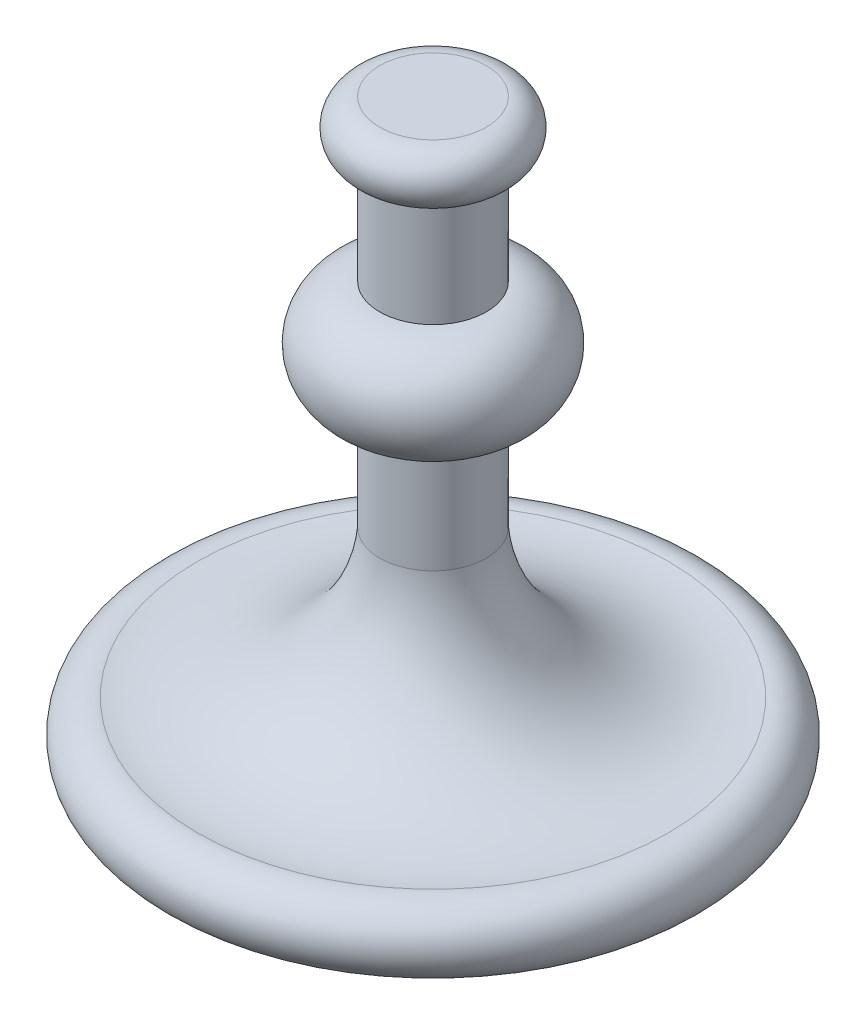
ISO-10303-21;
HEADER;
FILE_DESCRIPTION(('STEP AP214'),'2;1');
FILE_NAME('part.step','',(''),(''),'','','');
FILE_SCHEMA(('AUTOMOTIVE_DESIGN { 1 0 10303 214 1 1 1 1 }'));
ENDSEC;
DATA;
#1=APPLICATION_CONTEXT('core data for automotive mechanical design processes');
#2=APPLICATION_PROTOCOL_DEFINITION('international standard','automotive_design',2000,#1);
#3=PRODUCT_CONTEXT('',#1,'mechanical');
#4=PRODUCT('Part','Part','',(#3));
#5=PRODUCT_RELATED_PRODUCT_CATEGORY('part','',(#4));
#6=PRODUCT_DEFINITION_FORMATION('','',#4);
#7=PRODUCT_DEFINITION_CONTEXT('part definition',#1,'design');
#8=PRODUCT_DEFINITION('design','',#6,#7);
#9=PRODUCT_DEFINITION_SHAPE('','',#8);
#10=(LENGTH_UNIT() NAMED_UNIT(*) SI_UNIT(.MILLI.,.METRE.));
#11=(NAMED_UNIT(*) PLANE_ANGLE_UNIT() SI_UNIT($,.RADIAN.));
#12=(NAMED_UNIT(*) SI_UNIT($,.STERADIAN.) SOLID_ANGLE_UNIT());
#13=UNCERTAINTY_MEASURE_WITH_UNIT(LENGTH_MEASURE(1.E-05),#10,'distance_accuracy_value','');
#14=(GEOMETRIC_REPRESENTATION_CONTEXT(3) GLOBAL_UNCERTAINTY_ASSIGNED_CONTEXT((#13)) GLOBAL_UNIT_ASSIGNED_CONTEXT((#10,
#11,#12)) REPRESENTATION_CONTEXT('',''));
#15=CARTESIAN_POINT('',(0.,0.,0.));
#16=DIRECTION('',(0.,0.,1.));
#17=DIRECTION('',(1.,0.,0.));
#18=AXIS2_PLACEMENT_3D('',#15,#16,#17);
#19=CARTESIAN_POINT('',(0.,0.,0.));
#20=DIRECTION('',(0.,-1.,0.));
#21=DIRECTION('',(0.,0.,-1.));
#22=AXIS2_PLACEMENT_3D('',#19,#20,#21);
#23=PLANE('',#22);
#24=CARTESIAN_POINT('',(0.,0.,0.));
#25=DIRECTION('',(0.,-1.,0.));
#26=DIRECTION('',(0.,0.,-1.));
#27=AXIS2_PLACEMENT_3D('',#24,#25,#26);
#28=CIRCLE('',#27,90.);
#29=CARTESIAN_POINT('',(0.,0.,-90.));
#30=VERTEX_POINT('',#29);
#31=EDGE_CURVE('E10',#30,#30,#28,.T.);
#32=ORIENTED_EDGE('',*,*,#31,.T.);
#33=EDGE_LOOP('',(#32));
#34=FACE_BOUND('',#33,.T.);
#35=ADVANCED_FACE('F31',(#34),#23,.T.);
#36=CARTESIAN_POINT('',(0.,12.5,0.));
#37=DIRECTION('',(0.,-1.,0.));
#38=DIRECTION('',(0.,0.,-1.));
#39=AXIS2_PLACEMENT_3D('',#36,#37,#38);
#40=TOROIDAL_SURFACE('',#39,90.,12.5);
#41=CARTESIAN_POINT('',(0.,24.8768147133355,0.));
#42=DIRECTION('',(0.,-1.,0.));
#43=DIRECTION('',(0.,0.,-1.));
#44=AXIS2_PLACEMENT_3D('',#41,#42,#43);
#45=CIRCLE('',#44,88.2494407888445);
#46=CARTESIAN_POINT('',(0.,24.8768147133355,-88.2494407888445));
#47=VERTEX_POINT('',#46);
#48=EDGE_CURVE('E37',#47,#47,#45,.T.);
#49=ORIENTED_EDGE('',*,*,#48,.T.);
#50=EDGE_LOOP('',(#49));
#51=FACE_BOUND('',#50,.T.);
#52=ORIENTED_EDGE('',*,*,#31,.F.);
#53=EDGE_LOOP('',(#52));
#54=FACE_BOUND('',#53,.T.);
#55=ADVANCED_FACE('F72',(#51,#54),#40,.T.);
#56=CARTESIAN_POINT('',(0.,84.285525337346,0.));
#57=DIRECTION('',(0.,-1.,0.));
#58=DIRECTION('',(0.,0.,-1.));
#59=AXIS2_PLACEMENT_3D('',#56,#57,#58);
#60=TOROIDAL_SURFACE('',#59,79.8467565752979,60.);
#61=CARTESIAN_POINT('',(0.,80.,0.));
#62=DIRECTION('',(0.,-1.,0.));
#63=DIRECTION('',(0.,0.,-1.));
#64=AXIS2_PLACEMENT_3D('',#61,#62,#63);
#65=CIRCLE('',#64,20.);
#66=CARTESIAN_POINT('',(0.,80.,-20.));
#67=VERTEX_POINT('',#66);
#68=EDGE_CURVE('E41',#67,#67,#65,.T.);
#69=ORIENTED_EDGE('',*,*,#68,.T.);
#70=EDGE_LOOP('',(#69));
#71=FACE_BOUND('',#70,.T.);
#72=ORIENTED_EDGE('',*,*,#48,.F.);
#73=EDGE_LOOP('',(#72));
#74=FACE_BOUND('',#73,.T.);
#75=ADVANCED_FACE('F76',(#71,#74),#60,.F.);
#76=CARTESIAN_POINT('',(0.,0.,0.));
#77=DIRECTION('',(0.,-1.,0.));
#78=DIRECTION('',(0.,0.,-1.));
#79=AXIS2_PLACEMENT_3D('',#76,#77,#78);
#80=CYLINDRICAL_SURFACE('',#79,20.);
#81=CARTESIAN_POINT('',(0.,120.,0.));
#82=DIRECTION('',(0.,-1.,0.));
#83=DIRECTION('',(0.,0.,-1.));
#84=AXIS2_PLACEMENT_3D('',#81,#82,#83);
#85=CIRCLE('',#84,20.);
#86=CARTESIAN_POINT('',(0.,120.,-20.));
#87=VERTEX_POINT('',#86);
#88=EDGE_CURVE('E45',#87,#87,#85,.T.);
#89=ORIENTED_EDGE('',*,*,#88,.T.);
#90=EDGE_LOOP('',(#89));
#91=FACE_BOUND('',#90,.T.);
#92=ORIENTED_EDGE('',*,*,#68,.F.);
#93=EDGE_LOOP('',(#92));
#94=FACE_BOUND('',#93,.T.);
#95=ADVANCED_FACE('F80',(#91,#94),#80,.T.);
#96=CARTESIAN_POINT('',(0.,140.,0.));
#97=DIRECTION('',(0.,-1.,0.));
#98=DIRECTION('',(0.,0.,-1.));
#99=AXIS2_PLACEMENT_3D('',#96,#97,#98);
#100=TOROIDAL_SURFACE('',#99,20.,20.);
#101=CARTESIAN_POINT('',(0.,160.,0.));
#102=DIRECTION('',(0.,-1.,0.));
#103=DIRECTION('',(0.,0.,-1.));
#104=AXIS2_PLACEMENT_3D('',#101,#102,#103);
#105=CIRCLE('',#104,20.);
#106=CARTESIAN_POINT('',(0.,160.,-20.));
#107=VERTEX_POINT('',#106);
#108=EDGE_CURVE('E50',#107,#107,#105,.T.);
#109=ORIENTED_EDGE('',*,*,#108,.T.);
#110=EDGE_LOOP('',(#109));
#111=FACE_BOUND('',#110,.T.);
#112=ORIENTED_EDGE('',*,*,#88,.F.);
#113=EDGE_LOOP('',(#112));
#114=FACE_BOUND('',#113,.T.);
#115=ADVANCED_FACE('F87',(#111,#114),#100,.T.);
#116=CARTESIAN_POINT('',(0.,0.,0.));
#117=DIRECTION('',(0.,-1.,0.));
#118=DIRECTION('',(0.,0.,-1.));
#119=AXIS2_PLACEMENT_3D('',#116,#117,#118);
#120=CYLINDRICAL_SURFACE('',#119,20.);
#121=CARTESIAN_POINT('',(0.,200.,0.));
#122=DIRECTION('',(0.,-1.,0.));
#123=DIRECTION('',(0.,0.,-1.));
#124=AXIS2_PLACEMENT_3D('',#121,#122,#123);
#125=CIRCLE('',#124,20.);
#126=CARTESIAN_POINT('',(0.,200.,-20.));
#127=VERTEX_POINT('',#126);
#128=EDGE_CURVE('E53',#127,#127,#125,.T.);
#129=ORIENTED_EDGE('',*,*,#128,.T.);
#130=EDGE_LOOP('',(#129));
#131=FACE_BOUND('',#130,.T.);
#132=ORIENTED_EDGE('',*,*,#108,.F.);
#133=EDGE_LOOP('',(#132));
#134=FACE_BOUND('',#133,.T.);
#135=ADVANCED_FACE('F69',(#131,#134),#120,.T.);
#136=CARTESIAN_POINT('',(0.,210.,0.));
#137=DIRECTION('',(0.,-1.,0.));
#138=DIRECTION('',(0.,0.,-1.));
#139=AXIS2_PLACEMENT_3D('',#136,#137,#138);
#140=TOROIDAL_SURFACE('',#139,20.,10.);
#141=CARTESIAN_POINT('',(0.,220.,0.));
#142=DIRECTION('',(0.,-1.,0.));
#143=DIRECTION('',(0.,0.,-1.));
#144=AXIS2_PLACEMENT_3D('',#141,#142,#143);
#145=CIRCLE('',#144,20.);
#146=CARTESIAN_POINT('',(0.,220.,-20.));
#147=VERTEX_POINT('',#146);
#148=EDGE_CURVE('E56',#147,#147,#145,.T.);
#149=ORIENTED_EDGE('',*,*,#148,.T.);
#150=EDGE_LOOP('',(#149));
#151=FACE_BOUND('',#150,.T.);
#152=ORIENTED_EDGE('',*,*,#128,.F.);
#153=EDGE_LOOP('',(#152));
#154=FACE_BOUND('',#153,.T.);
#155=ADVANCED_FACE('F60',(#151,#154),#140,.T.);
#156=CARTESIAN_POINT('',(0.,220.,0.));
#157=DIRECTION('',(0.,1.,0.));
#158=DIRECTION('',(0.,0.,1.));
#159=AXIS2_PLACEMENT_3D('',#156,#157,#158);
#160=PLANE('',#159);
#161=ORIENTED_EDGE('',*,*,#148,.F.);
#162=EDGE_LOOP('',(#161));
#163=FACE_BOUND('',#162,.T.);
#164=ADVANCED_FACE('F63',(#163),#160,.T.);
#165=CLOSED_SHELL('',(#35,#55,#75,#95,#115,#135,#155,#164));
#166=MANIFOLD_SOLID_BREP('B2',#165);
#167=ADVANCED_BREP_SHAPE_REPRESENTATION('',(#18,#166),#14);
#168=SHAPE_DEFINITION_REPRESENTATION(#9,#167);
ENDSEC;
END-ISO-10303-21;
